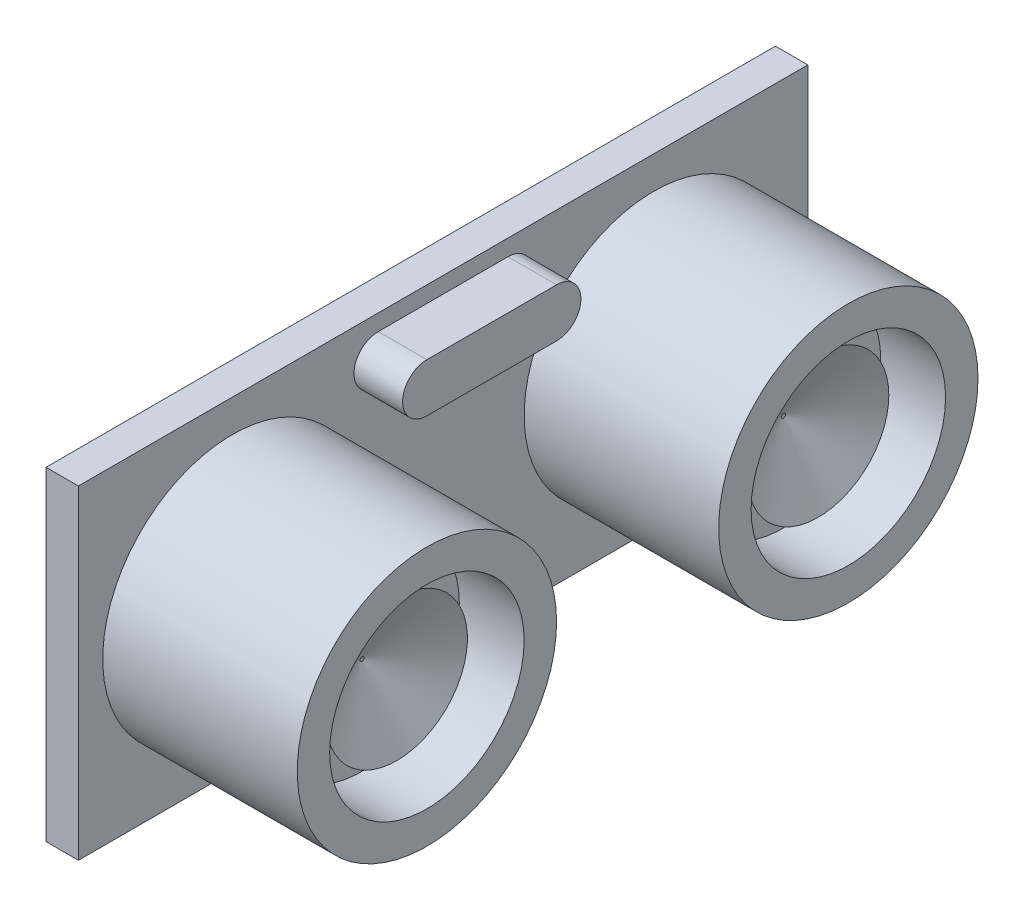
ISO-10303-21;
HEADER;
FILE_DESCRIPTION(('STEP AP214'),'2;1');
FILE_NAME('part.step','',(''),(''),'','','');
FILE_SCHEMA(('AUTOMOTIVE_DESIGN { 1 0 10303 214 1 1 1 1 }'));
ENDSEC;
DATA;
#1=APPLICATION_CONTEXT('core data for automotive mechanical design processes');
#2=APPLICATION_PROTOCOL_DEFINITION('international standard','automotive_design',2000,#1);
#3=PRODUCT_CONTEXT('',#1,'mechanical');
#4=PRODUCT('Part','Part','',(#3));
#5=PRODUCT_RELATED_PRODUCT_CATEGORY('part','',(#4));
#6=PRODUCT_DEFINITION_FORMATION('','',#4);
#7=PRODUCT_DEFINITION_CONTEXT('part definition',#1,'design');
#8=PRODUCT_DEFINITION('design','',#6,#7);
#9=PRODUCT_DEFINITION_SHAPE('','',#8);
#10=(LENGTH_UNIT() NAMED_UNIT(*) SI_UNIT(.MILLI.,.METRE.));
#11=(NAMED_UNIT(*) PLANE_ANGLE_UNIT() SI_UNIT($,.RADIAN.));
#12=(NAMED_UNIT(*) SI_UNIT($,.STERADIAN.) SOLID_ANGLE_UNIT());
#13=UNCERTAINTY_MEASURE_WITH_UNIT(LENGTH_MEASURE(1.E-05),#10,'distance_accuracy_value','');
#14=(GEOMETRIC_REPRESENTATION_CONTEXT(3) GLOBAL_UNCERTAINTY_ASSIGNED_CONTEXT((#13)) GLOBAL_UNIT_ASSIGNED_CONTEXT((#10,
#11,#12)) REPRESENTATION_CONTEXT('',''));
#15=CARTESIAN_POINT('',(0.,0.,0.));
#16=DIRECTION('',(0.,0.,1.));
#17=DIRECTION('',(1.,0.,0.));
#18=AXIS2_PLACEMENT_3D('',#15,#16,#17);
#19=CARTESIAN_POINT('',(10.,0.,-13.));
#20=DIRECTION('',(1.,0.,0.));
#21=DIRECTION('',(0.,0.,-1.));
#22=AXIS2_PLACEMENT_3D('',#19,#20,#21);
#23=CONICAL_SURFACE('',#22,0.123728157781812,1.1017305072658);
#24=CARTESIAN_POINT('',(12.1437341267027,0.,-13.));
#25=DIRECTION('',(-1.,0.,0.));
#26=DIRECTION('',(0.,0.,1.));
#27=AXIS2_PLACEMENT_3D('',#24,#25,#26);
#28=CIRCLE('',#27,4.35374243041184);
#29=CARTESIAN_POINT('',(12.1437341267027,0.,-17.3537424304118));
#30=VERTEX_POINT('',#29);
#31=EDGE_CURVE('E52',#30,#30,#28,.T.);
#32=CARTESIAN_POINT('',(10.,0.,-13.));
#33=DIRECTION('',(-1.,0.,0.));
#34=DIRECTION('',(0.,0.,1.));
#35=AXIS2_PLACEMENT_3D('',#32,#33,#34);
#36=CIRCLE('',#35,0.123728157781812);
#37=CARTESIAN_POINT('',(10.,0.,-13.1237281577818));
#38=VERTEX_POINT('',#37);
#39=EDGE_CURVE('E11',#38,#38,#36,.T.);
#40=CARTESIAN_POINT('',(12.1437341267027,0.,-17.3537424304118));
#41=CARTESIAN_POINT('',(12.1214035628829,0.,-17.3096797817386));
#42=CARTESIAN_POINT('',(12.0990729990631,0.,-17.2656171330654));
#43=CARTESIAN_POINT('',(12.0544118714235,0.,-17.1774918357189));
#44=CARTESIAN_POINT('',(12.0320813076036,0.,-17.1334291870457));
#45=CARTESIAN_POINT('',(11.987420179964,0.,-17.0453038896992));
#46=CARTESIAN_POINT('',(11.9650896161442,0.,-17.001241241026));
#47=CARTESIAN_POINT('',(11.9204284885045,0.,-16.9131159436795));
#48=CARTESIAN_POINT('',(11.8980979246847,0.,-16.8690532950063));
#49=CARTESIAN_POINT('',(11.8534367970451,0.,-16.7809279976599));
#50=CARTESIAN_POINT('',(11.8311062332253,0.,-16.7368653489866));
#51=CARTESIAN_POINT('',(11.7864451055856,0.,-16.6487400516402));
#52=CARTESIAN_POINT('',(11.7641145417658,0.,-16.6046774029669));
#53=CARTESIAN_POINT('',(11.7194534141262,0.,-16.5165521056205));
#54=CARTESIAN_POINT('',(11.6971228503063,0.,-16.4724894569473));
#55=CARTESIAN_POINT('',(11.6524617226667,0.,-16.3843641596008));
#56=CARTESIAN_POINT('',(11.6301311588469,0.,-16.3403015109276));
#57=CARTESIAN_POINT('',(11.5854700312072,0.,-16.2521762135811));
#58=CARTESIAN_POINT('',(11.5631394673874,0.,-16.2081135649079));
#59=CARTESIAN_POINT('',(11.5184783397478,0.,-16.1199882675614));
#60=CARTESIAN_POINT('',(11.496147775928,0.,-16.0759256188882));
#61=CARTESIAN_POINT('',(11.4514866482883,0.,-15.9878003215417));
#62=CARTESIAN_POINT('',(11.4291560844685,0.,-15.9437376728685));
#63=CARTESIAN_POINT('',(11.3844949568289,0.,-15.855612375522));
#64=CARTESIAN_POINT('',(11.362164393009,0.,-15.8115497268488));
#65=CARTESIAN_POINT('',(11.3175032653694,0.,-15.7234244295023));
#66=CARTESIAN_POINT('',(11.2951727015496,0.,-15.6793617808291));
#67=CARTESIAN_POINT('',(11.2505115739099,0.,-15.5912364834827));
#68=CARTESIAN_POINT('',(11.2281810100901,0.,-15.5471738348094));
#69=CARTESIAN_POINT('',(11.1835198824505,0.,-15.459048537463));
#70=CARTESIAN_POINT('',(11.1611893186307,0.,-15.4149858887897));
#71=CARTESIAN_POINT('',(11.116528190991,0.,-15.3268605914433));
#72=CARTESIAN_POINT('',(11.0941976271712,0.,-15.2827979427701));
#73=CARTESIAN_POINT('',(11.0495364995316,0.,-15.1946726454236));
#74=CARTESIAN_POINT('',(11.0272059357117,0.,-15.1506099967504));
#75=CARTESIAN_POINT('',(10.9825448080721,0.,-15.0624846994039));
#76=CARTESIAN_POINT('',(10.9602142442523,0.,-15.0184220507307));
#77=CARTESIAN_POINT('',(10.9155531166126,0.,-14.9302967533842));
#78=CARTESIAN_POINT('',(10.8932225527928,0.,-14.886234104711));
#79=CARTESIAN_POINT('',(10.8485614251532,0.,-14.7981088073645));
#80=CARTESIAN_POINT('',(10.8262308613334,0.,-14.7540461586913));
#81=CARTESIAN_POINT('',(10.7815697336937,0.,-14.6659208613448));
#82=CARTESIAN_POINT('',(10.7592391698739,0.,-14.6218582126716));
#83=CARTESIAN_POINT('',(10.7145780422343,0.,-14.5337329153252));
#84=CARTESIAN_POINT('',(10.6922474784144,0.,-14.4896702666519));
#85=CARTESIAN_POINT('',(10.6475863507748,0.,-14.4015449693055));
#86=CARTESIAN_POINT('',(10.625255786955,0.,-14.3574823206322));
#87=CARTESIAN_POINT('',(10.5805946593153,0.,-14.2693570232858));
#88=CARTESIAN_POINT('',(10.5582640954955,0.,-14.2252943746125));
#89=CARTESIAN_POINT('',(10.5136029678559,0.,-14.1371690772661));
#90=CARTESIAN_POINT('',(10.491272404036,0.,-14.0931064285929));
#91=CARTESIAN_POINT('',(10.4466112763964,0.,-14.0049811312464));
#92=CARTESIAN_POINT('',(10.4242807125766,0.,-13.9609184825732));
#93=CARTESIAN_POINT('',(10.3796195849369,0.,-13.8727931852267));
#94=CARTESIAN_POINT('',(10.3572890211171,0.,-13.8287305365535));
#95=CARTESIAN_POINT('',(10.3126278934775,0.,-13.740605239207));
#96=CARTESIAN_POINT('',(10.2902973296577,0.,-13.6965425905338));
#97=CARTESIAN_POINT('',(10.245636202018,0.,-13.6084172931873));
#98=CARTESIAN_POINT('',(10.2233056381982,0.,-13.5643546445141));
#99=CARTESIAN_POINT('',(10.1786445105586,0.,-13.4762293471676));
#100=CARTESIAN_POINT('',(10.1563139467387,0.,-13.4321666984944));
#101=CARTESIAN_POINT('',(10.1116528190991,0.,-13.344041401148));
#102=CARTESIAN_POINT('',(10.0893222552793,0.,-13.2999787524747));
#103=CARTESIAN_POINT('',(10.0446611276396,0.,-13.2118534551283));
#104=CARTESIAN_POINT('',(10.0223305638198,0.,-13.167790806455));
#105=CARTESIAN_POINT('',(10.,0.,-13.1237281577818));
#106=B_SPLINE_CURVE_WITH_KNOTS('',3,(#40,#41,#42,#43,#44,#45,#46,#47,#48,#49,#50,#51,#52,#53,
#54,#55,#56,#57,#58,#59,#60,#61,#62,#63,#64,#65,#66,#67,#68,#69,#70,#71,#72,#73,#74,#75,#76,#77,
#78,#79,#80,#81,#82,#83,#84,#85,#86,#87,#88,#89,#90,#91,#92,#93,#94,#95,#96,#97,#98,#99,#100,
#101,#102,#103,#104,#105),.UNSPECIFIED.,.F.,.F.,(4,2,2,2,2,2,2,2,2,2,2,2,2,2,2,2,2,2,2,2,2,2,2,
2,2,2,2,2,2,2,2,2,4),(0.,0.148194263713221,0.296388527426442,0.444582791139659,
0.592777054852881,0.740971318566102,0.889165582279323,1.03735984599254,1.18555410970576,
1.33374837341899,1.48194263713221,1.63013690084543,1.77833116455865,1.92652542827187,
2.07471969198509,2.22291395569831,2.37110821941153,2.51930248312475,2.66749674683797,
2.81569101055119,2.96388527426442,3.11207953797764,3.26027380169086,3.40846806540408,
3.5566623291173,3.70485659283052,3.85305085654374,4.00124512025696,4.14943938397018,
4.2976336476834,4.44582791139662,4.59402217510984,4.74221643882306),.UNSPECIFIED.);
#107=EDGE_CURVE('BSEAM46',#30,#38,#106,.T.);
#108=ORIENTED_EDGE('',*,*,#31,.F.);
#109=ORIENTED_EDGE('',*,*,#39,.T.);
#110=ORIENTED_EDGE('',*,*,#107,.T.);
#111=ORIENTED_EDGE('',*,*,#107,.F.);
#112=EDGE_LOOP('',(#108,#110,#109,#111));
#113=FACE_BOUND('',#112,.T.);
#114=ADVANCED_FACE('F46',(#113),#23,.F.);
#115=CARTESIAN_POINT('',(12.1437341267027,0.,-17.3537424304118));
#116=CARTESIAN_POINT('',(9.98096245611618,0.,-15.851185466727));
#117=CARTESIAN_POINT('',(10.,0.,-13.1237281577818));
#118=B_SPLINE_CURVE_WITH_KNOTS('',2,(#115,#116,#117),.UNSPECIFIED.,.F.,.F.,(3,3),(0.,1.),.UNSPECIFIED.);
#119=CARTESIAN_POINT('',(10.,0.,-13.));
#120=DIRECTION('',(-1.,0.,0.));
#121=AXIS1_PLACEMENT('',#119,#120);
#122=SURFACE_OF_REVOLUTION('',#118,#121);
#123=ORIENTED_EDGE('',*,*,#39,.F.);
#124=EDGE_LOOP('',(#123));
#125=FACE_BOUND('',#124,.T.);
#126=ORIENTED_EDGE('',*,*,#31,.T.);
#127=EDGE_LOOP('',(#126));
#128=FACE_BOUND('',#127,.T.);
#129=ADVANCED_FACE('F65',(#125,#128),#122,.T.);
#130=CLOSED_SHELL('',(#114,#129));
#131=MANIFOLD_SOLID_BREP('B2',#130);
#132=CARTESIAN_POINT('',(10.,0.,13.));
#133=DIRECTION('',(1.,0.,0.));
#134=DIRECTION('',(0.,0.,-1.));
#135=AXIS2_PLACEMENT_3D('',#132,#133,#134);
#136=PLANE('',#135);
#137=CARTESIAN_POINT('',(10.,0.,13.));
#138=DIRECTION('',(1.,0.,0.));
#139=DIRECTION('',(0.,0.,-1.));
#140=AXIS2_PLACEMENT_3D('',#137,#138,#139);
#141=CIRCLE('',#140,6.);
#142=CARTESIAN_POINT('',(10.,0.,7.));
#143=VERTEX_POINT('',#142);
#144=EDGE_CURVE('E266',#143,#143,#141,.T.);
#145=ORIENTED_EDGE('',*,*,#144,.T.);
#146=EDGE_LOOP('',(#145));
#147=FACE_BOUND('',#146,.T.);
#148=CARTESIAN_POINT('',(10.,0.,13.));
#149=DIRECTION('',(-1.,0.,0.));
#150=DIRECTION('',(0.,0.,1.));
#151=AXIS2_PLACEMENT_3D('',#148,#149,#150);
#152=CIRCLE('',#151,0.21854967621838);
#153=CARTESIAN_POINT('',(10.,0.,13.2185496762184));
#154=VERTEX_POINT('',#153);
#155=EDGE_CURVE('E88',#154,#154,#152,.T.);
#156=ORIENTED_EDGE('',*,*,#155,.T.);
#157=EDGE_LOOP('',(#156));
#158=FACE_BOUND('',#157,.T.);
#159=ADVANCED_FACE('F84',(#147,#158),#136,.T.);
#160=CARTESIAN_POINT('',(2.,0.,0.));
#161=DIRECTION('',(1.,0.,0.));
#162=DIRECTION('',(0.,0.,-1.));
#163=AXIS2_PLACEMENT_3D('',#160,#161,#162);
#164=PLANE('',#163);
#165=CARTESIAN_POINT('',(2.,0.,13.));
#166=DIRECTION('',(1.,0.,0.));
#167=DIRECTION('',(0.,0.,-1.));
#168=AXIS2_PLACEMENT_3D('',#165,#166,#167);
#169=CIRCLE('',#168,8.);
#170=CARTESIAN_POINT('',(2.,0.,5.));
#171=VERTEX_POINT('',#170);
#172=EDGE_CURVE('E274',#171,#171,#169,.T.);
#173=ORIENTED_EDGE('',*,*,#172,.F.);
#174=EDGE_LOOP('',(#173));
#175=FACE_BOUND('',#174,.T.);
#176=DIRECTION('',(0.,-1.,0.));
#177=VECTOR('',#176,1.);
#178=CARTESIAN_POINT('',(2.,10.,22.5));
#179=LINE('',#178,#177);
#180=CARTESIAN_POINT('',(2.,10.,22.5));
#181=VERTEX_POINT('',#180);
#182=CARTESIAN_POINT('',(2.,-10.,22.5));
#183=VERTEX_POINT('',#182);
#184=EDGE_CURVE('E190',#181,#183,#179,.T.);
#185=ORIENTED_EDGE('',*,*,#184,.T.);
#186=DIRECTION('',(0.,0.,-1.));
#187=VECTOR('',#186,1.);
#188=CARTESIAN_POINT('',(2.,-10.,22.5));
#189=LINE('',#188,#187);
#190=CARTESIAN_POINT('',(2.,-9.99999999999999,-22.5));
#191=VERTEX_POINT('',#190);
#192=EDGE_CURVE('E135',#183,#191,#189,.T.);
#193=ORIENTED_EDGE('',*,*,#192,.T.);
#194=DIRECTION('',(0.,-1.,0.));
#195=VECTOR('',#194,1.);
#196=CARTESIAN_POINT('',(2.,10.,-22.5));
#197=LINE('',#196,#195);
#198=CARTESIAN_POINT('',(2.,10.,-22.5));
#199=VERTEX_POINT('',#198);
#200=EDGE_CURVE('E194',#199,#191,#197,.T.);
#201=ORIENTED_EDGE('',*,*,#200,.F.);
#202=DIRECTION('',(0.,0.,-1.));
#203=VECTOR('',#202,1.);
#204=CARTESIAN_POINT('',(2.,10.,22.5));
#205=LINE('',#204,#203);
#206=EDGE_CURVE('E197',#181,#199,#205,.T.);
#207=ORIENTED_EDGE('',*,*,#206,.F.);
#208=EDGE_LOOP('',(#185,#193,#201,#207));
#209=FACE_BOUND('',#208,.T.);
#210=DIRECTION('',(0.,0.,-1.));
#211=VECTOR('',#210,1.);
#212=CARTESIAN_POINT('',(2.,6.,4.));
#213=LINE('',#212,#211);
#214=CARTESIAN_POINT('',(2.,6.,4.));
#215=VERTEX_POINT('',#214);
#216=CARTESIAN_POINT('',(2.,6.,-4.));
#217=VERTEX_POINT('',#216);
#218=EDGE_CURVE('E286',#215,#217,#213,.T.);
#219=ORIENTED_EDGE('',*,*,#218,.F.);
#220=CARTESIAN_POINT('',(2.,7.5,4.));
#221=DIRECTION('',(1.,0.,0.));
#222=DIRECTION('',(0.,0.,-1.));
#223=AXIS2_PLACEMENT_3D('',#220,#221,#222);
#224=CIRCLE('',#223,1.5);
#225=CARTESIAN_POINT('',(2.,9.,4.));
#226=VERTEX_POINT('',#225);
#227=EDGE_CURVE('E181',#226,#215,#224,.T.);
#228=ORIENTED_EDGE('',*,*,#227,.F.);
#229=DIRECTION('',(0.,0.,1.));
#230=VECTOR('',#229,1.);
#231=CARTESIAN_POINT('',(2.,9.,4.));
#232=LINE('',#231,#230);
#233=CARTESIAN_POINT('',(2.,9.,-4.));
#234=VERTEX_POINT('',#233);
#235=EDGE_CURVE('E177',#234,#226,#232,.T.);
#236=ORIENTED_EDGE('',*,*,#235,.F.);
#237=CARTESIAN_POINT('',(2.,7.5,-4.));
#238=DIRECTION('',(1.,0.,0.));
#239=DIRECTION('',(0.,0.,-1.));
#240=AXIS2_PLACEMENT_3D('',#237,#238,#239);
#241=CIRCLE('',#240,1.5);
#242=EDGE_CURVE('E288',#217,#234,#241,.T.);
#243=ORIENTED_EDGE('',*,*,#242,.F.);
#244=EDGE_LOOP('',(#219,#228,#236,#243));
#245=FACE_BOUND('',#244,.T.);
#246=CARTESIAN_POINT('',(2.,0.,-13.));
#247=DIRECTION('',(1.,0.,0.));
#248=DIRECTION('',(0.,0.,-1.));
#249=AXIS2_PLACEMENT_3D('',#246,#247,#248);
#250=CIRCLE('',#249,8.);
#251=CARTESIAN_POINT('',(2.,0.,-21.));
#252=VERTEX_POINT('',#251);
#253=EDGE_CURVE('E268',#252,#252,#250,.T.);
#254=ORIENTED_EDGE('',*,*,#253,.F.);
#255=EDGE_LOOP('',(#254));
#256=FACE_BOUND('',#255,.T.);
#257=ADVANCED_FACE('F220',(#175,#209,#245,#256),#164,.T.);
#258=CARTESIAN_POINT('',(2.,10.,22.5));
#259=DIRECTION('',(0.,0.,-1.));
#260=DIRECTION('',(-1.,0.,0.));
#261=AXIS2_PLACEMENT_3D('',#258,#259,#260);
#262=PLANE('',#261);
#263=DIRECTION('',(0.,-1.,0.));
#264=VECTOR('',#263,1.);
#265=CARTESIAN_POINT('',(0.,10.,22.5));
#266=LINE('',#265,#264);
#267=CARTESIAN_POINT('',(0.,10.,22.5));
#268=VERTEX_POINT('',#267);
#269=CARTESIAN_POINT('',(0.,-10.,22.5));
#270=VERTEX_POINT('',#269);
#271=EDGE_CURVE('E183',#268,#270,#266,.T.);
#272=ORIENTED_EDGE('',*,*,#271,.T.);
#273=DIRECTION('',(-1.,0.,0.));
#274=VECTOR('',#273,1.);
#275=CARTESIAN_POINT('',(2.,-10.,22.5));
#276=LINE('',#275,#274);
#277=EDGE_CURVE('E44',#183,#270,#276,.T.);
#278=ORIENTED_EDGE('',*,*,#277,.F.);
#279=ORIENTED_EDGE('',*,*,#184,.F.);
#280=DIRECTION('',(-1.,0.,0.));
#281=VECTOR('',#280,1.);
#282=CARTESIAN_POINT('',(2.,10.,22.5));
#283=LINE('',#282,#281);
#284=EDGE_CURVE('E109',#181,#268,#283,.T.);
#285=ORIENTED_EDGE('',*,*,#284,.T.);
#286=EDGE_LOOP('',(#272,#278,#279,#285));
#287=FACE_BOUND('',#286,.T.);
#288=ADVANCED_FACE('F86',(#287),#262,.F.);
#289=CARTESIAN_POINT('',(2.,-10.,22.5));
#290=DIRECTION('',(0.,1.,0.));
#291=DIRECTION('',(0.,0.,1.));
#292=AXIS2_PLACEMENT_3D('',#289,#290,#291);
#293=PLANE('',#292);
#294=DIRECTION('',(0.,0.,-1.));
#295=VECTOR('',#294,1.);
#296=CARTESIAN_POINT('',(0.,-10.,22.5));
#297=LINE('',#296,#295);
#298=CARTESIAN_POINT('',(0.,-9.99999999999999,-22.5));
#299=VERTEX_POINT('',#298);
#300=EDGE_CURVE('E185',#270,#299,#297,.T.);
#301=ORIENTED_EDGE('',*,*,#300,.T.);
#302=DIRECTION('',(-1.,0.,0.));
#303=VECTOR('',#302,1.);
#304=CARTESIAN_POINT('',(2.,-9.99999999999999,-22.5));
#305=LINE('',#304,#303);
#306=EDGE_CURVE('E93',#191,#299,#305,.T.);
#307=ORIENTED_EDGE('',*,*,#306,.F.);
#308=ORIENTED_EDGE('',*,*,#192,.F.);
#309=ORIENTED_EDGE('',*,*,#277,.T.);
#310=EDGE_LOOP('',(#301,#307,#308,#309));
#311=FACE_BOUND('',#310,.T.);
#312=ADVANCED_FACE('F213',(#311),#293,.F.);
#313=CARTESIAN_POINT('',(2.,10.,-22.5));
#314=DIRECTION('',(0.,0.,-1.));
#315=DIRECTION('',(-1.,0.,0.));
#316=AXIS2_PLACEMENT_3D('',#313,#314,#315);
#317=PLANE('',#316);
#318=DIRECTION('',(0.,-1.,0.));
#319=VECTOR('',#318,1.);
#320=CARTESIAN_POINT('',(0.,10.,-22.5));
#321=LINE('',#320,#319);
#322=CARTESIAN_POINT('',(0.,10.,-22.5));
#323=VERTEX_POINT('',#322);
#324=EDGE_CURVE('E201',#323,#299,#321,.T.);
#325=ORIENTED_EDGE('',*,*,#324,.F.);
#326=DIRECTION('',(-1.,0.,0.));
#327=VECTOR('',#326,1.);
#328=CARTESIAN_POINT('',(2.,10.,-22.5));
#329=LINE('',#328,#327);
#330=EDGE_CURVE('E207',#199,#323,#329,.T.);
#331=ORIENTED_EDGE('',*,*,#330,.F.);
#332=ORIENTED_EDGE('',*,*,#200,.T.);
#333=ORIENTED_EDGE('',*,*,#306,.T.);
#334=EDGE_LOOP('',(#325,#331,#332,#333));
#335=FACE_BOUND('',#334,.T.);
#336=ADVANCED_FACE('F211',(#335),#317,.T.);
#337=CARTESIAN_POINT('',(2.,10.,22.5));
#338=DIRECTION('',(0.,1.,0.));
#339=DIRECTION('',(0.,0.,1.));
#340=AXIS2_PLACEMENT_3D('',#337,#338,#339);
#341=PLANE('',#340);
#342=DIRECTION('',(0.,0.,-1.));
#343=VECTOR('',#342,1.);
#344=CARTESIAN_POINT('',(0.,10.,22.5));
#345=LINE('',#344,#343);
#346=EDGE_CURVE('E192',#268,#323,#345,.T.);
#347=ORIENTED_EDGE('',*,*,#346,.F.);
#348=ORIENTED_EDGE('',*,*,#284,.F.);
#349=ORIENTED_EDGE('',*,*,#206,.T.);
#350=ORIENTED_EDGE('',*,*,#330,.T.);
#351=EDGE_LOOP('',(#347,#348,#349,#350));
#352=FACE_BOUND('',#351,.T.);
#353=ADVANCED_FACE('F217',(#352),#341,.T.);
#354=CARTESIAN_POINT('',(0.,0.,0.));
#355=DIRECTION('',(1.,0.,0.));
#356=DIRECTION('',(0.,0.,-1.));
#357=AXIS2_PLACEMENT_3D('',#354,#355,#356);
#358=PLANE('',#357);
#359=ORIENTED_EDGE('',*,*,#271,.F.);
#360=ORIENTED_EDGE('',*,*,#346,.T.);
#361=ORIENTED_EDGE('',*,*,#324,.T.);
#362=ORIENTED_EDGE('',*,*,#300,.F.);
#363=EDGE_LOOP('',(#359,#360,#361,#362));
#364=FACE_BOUND('',#363,.T.);
#365=ADVANCED_FACE('F216',(#364),#358,.F.);
#366=CARTESIAN_POINT('',(5.,7.5,4.));
#367=DIRECTION('',(-1.,0.,0.));
#368=DIRECTION('',(0.,0.,1.));
#369=AXIS2_PLACEMENT_3D('',#366,#367,#368);
#370=CYLINDRICAL_SURFACE('',#369,1.5);
#371=ORIENTED_EDGE('',*,*,#227,.T.);
#372=DIRECTION('',(-1.,0.,0.));
#373=VECTOR('',#372,1.);
#374=CARTESIAN_POINT('',(5.,6.,4.));
#375=LINE('',#374,#373);
#376=CARTESIAN_POINT('',(5.,6.,4.));
#377=VERTEX_POINT('',#376);
#378=EDGE_CURVE('E162',#377,#215,#375,.T.);
#379=ORIENTED_EDGE('',*,*,#378,.F.);
#380=CARTESIAN_POINT('',(5.,7.5,4.));
#381=DIRECTION('',(1.,0.,0.));
#382=DIRECTION('',(0.,0.,-1.));
#383=AXIS2_PLACEMENT_3D('',#380,#381,#382);
#384=CIRCLE('',#383,1.5);
#385=CARTESIAN_POINT('',(5.,9.,4.));
#386=VERTEX_POINT('',#385);
#387=EDGE_CURVE('E169',#386,#377,#384,.T.);
#388=ORIENTED_EDGE('',*,*,#387,.F.);
#389=DIRECTION('',(-1.,0.,0.));
#390=VECTOR('',#389,1.);
#391=CARTESIAN_POINT('',(5.,9.,4.));
#392=LINE('',#391,#390);
#393=EDGE_CURVE('E284',#386,#226,#392,.T.);
#394=ORIENTED_EDGE('',*,*,#393,.T.);
#395=EDGE_LOOP('',(#371,#379,#388,#394));
#396=FACE_BOUND('',#395,.T.);
#397=ADVANCED_FACE('F179',(#396),#370,.T.);
#398=CARTESIAN_POINT('',(5.,6.,4.));
#399=DIRECTION('',(0.,1.,0.));
#400=DIRECTION('',(0.,0.,1.));
#401=AXIS2_PLACEMENT_3D('',#398,#399,#400);
#402=PLANE('',#401);
#403=ORIENTED_EDGE('',*,*,#218,.T.);
#404=DIRECTION('',(-1.,0.,0.));
#405=VECTOR('',#404,1.);
#406=CARTESIAN_POINT('',(5.,6.,-4.));
#407=LINE('',#406,#405);
#408=CARTESIAN_POINT('',(5.,6.,-4.));
#409=VERTEX_POINT('',#408);
#410=EDGE_CURVE('E165',#409,#217,#407,.T.);
#411=ORIENTED_EDGE('',*,*,#410,.F.);
#412=DIRECTION('',(0.,0.,-1.));
#413=VECTOR('',#412,1.);
#414=CARTESIAN_POINT('',(5.,6.,4.));
#415=LINE('',#414,#413);
#416=EDGE_CURVE('E158',#377,#409,#415,.T.);
#417=ORIENTED_EDGE('',*,*,#416,.F.);
#418=ORIENTED_EDGE('',*,*,#378,.T.);
#419=EDGE_LOOP('',(#403,#411,#417,#418));
#420=FACE_BOUND('',#419,.T.);
#421=ADVANCED_FACE('F160',(#420),#402,.F.);
#422=CARTESIAN_POINT('',(5.,7.5,-4.));
#423=DIRECTION('',(-1.,0.,0.));
#424=DIRECTION('',(0.,0.,1.));
#425=AXIS2_PLACEMENT_3D('',#422,#423,#424);
#426=CYLINDRICAL_SURFACE('',#425,1.5);
#427=ORIENTED_EDGE('',*,*,#242,.T.);
#428=DIRECTION('',(-1.,0.,0.));
#429=VECTOR('',#428,1.);
#430=CARTESIAN_POINT('',(5.,9.,-4.));
#431=LINE('',#430,#429);
#432=CARTESIAN_POINT('',(5.,9.,-4.));
#433=VERTEX_POINT('',#432);
#434=EDGE_CURVE('E100',#433,#234,#431,.T.);
#435=ORIENTED_EDGE('',*,*,#434,.F.);
#436=CARTESIAN_POINT('',(5.,7.5,-4.));
#437=DIRECTION('',(1.,0.,0.));
#438=DIRECTION('',(0.,0.,-1.));
#439=AXIS2_PLACEMENT_3D('',#436,#437,#438);
#440=CIRCLE('',#439,1.5);
#441=EDGE_CURVE('E168',#409,#433,#440,.T.);
#442=ORIENTED_EDGE('',*,*,#441,.F.);
#443=ORIENTED_EDGE('',*,*,#410,.T.);
#444=EDGE_LOOP('',(#427,#435,#442,#443));
#445=FACE_BOUND('',#444,.T.);
#446=ADVANCED_FACE('F295',(#445),#426,.T.);
#447=CARTESIAN_POINT('',(5.,9.,4.));
#448=DIRECTION('',(0.,-1.,0.));
#449=DIRECTION('',(0.,0.,-1.));
#450=AXIS2_PLACEMENT_3D('',#447,#448,#449);
#451=PLANE('',#450);
#452=ORIENTED_EDGE('',*,*,#235,.T.);
#453=ORIENTED_EDGE('',*,*,#393,.F.);
#454=DIRECTION('',(0.,0.,1.));
#455=VECTOR('',#454,1.);
#456=CARTESIAN_POINT('',(5.,9.,4.));
#457=LINE('',#456,#455);
#458=EDGE_CURVE('E173',#433,#386,#457,.T.);
#459=ORIENTED_EDGE('',*,*,#458,.F.);
#460=ORIENTED_EDGE('',*,*,#434,.T.);
#461=EDGE_LOOP('',(#452,#453,#459,#460));
#462=FACE_BOUND('',#461,.T.);
#463=ADVANCED_FACE('F296',(#462),#451,.F.);
#464=CARTESIAN_POINT('',(5.,7.5,4.));
#465=DIRECTION('',(1.,0.,0.));
#466=DIRECTION('',(0.,0.,-1.));
#467=AXIS2_PLACEMENT_3D('',#464,#465,#466);
#468=PLANE('',#467);
#469=ORIENTED_EDGE('',*,*,#387,.T.);
#470=ORIENTED_EDGE('',*,*,#416,.T.);
#471=ORIENTED_EDGE('',*,*,#441,.T.);
#472=ORIENTED_EDGE('',*,*,#458,.T.);
#473=EDGE_LOOP('',(#469,#470,#471,#472));
#474=FACE_BOUND('',#473,.T.);
#475=ADVANCED_FACE('F172',(#474),#468,.T.);
#476=CARTESIAN_POINT('',(14.,0.,13.));
#477=DIRECTION('',(-1.,0.,0.));
#478=DIRECTION('',(0.,0.,1.));
#479=AXIS2_PLACEMENT_3D('',#476,#477,#478);
#480=CYLINDRICAL_SURFACE('',#479,8.);
#481=CARTESIAN_POINT('',(14.,0.,13.));
#482=DIRECTION('',(1.,0.,0.));
#483=DIRECTION('',(0.,0.,-1.));
#484=AXIS2_PLACEMENT_3D('',#481,#482,#483);
#485=CIRCLE('',#484,8.);
#486=CARTESIAN_POINT('',(14.,0.,5.));
#487=VERTEX_POINT('',#486);
#488=EDGE_CURVE('E277',#487,#487,#485,.T.);
#489=ORIENTED_EDGE('',*,*,#488,.F.);
#490=EDGE_LOOP('',(#489));
#491=FACE_BOUND('',#490,.T.);
#492=ORIENTED_EDGE('',*,*,#172,.T.);
#493=EDGE_LOOP('',(#492));
#494=FACE_BOUND('',#493,.T.);
#495=ADVANCED_FACE('F303',(#491,#494),#480,.T.);
#496=CARTESIAN_POINT('',(14.,0.,13.));
#497=DIRECTION('',(1.,0.,0.));
#498=DIRECTION('',(0.,0.,-1.));
#499=AXIS2_PLACEMENT_3D('',#496,#497,#498);
#500=PLANE('',#499);
#501=CARTESIAN_POINT('',(14.,0.,13.));
#502=DIRECTION('',(1.,0.,0.));
#503=DIRECTION('',(0.,0.,-1.));
#504=AXIS2_PLACEMENT_3D('',#501,#502,#503);
#505=CIRCLE('',#504,6.);
#506=CARTESIAN_POINT('',(14.,0.,7.));
#507=VERTEX_POINT('',#506);
#508=EDGE_CURVE('E263',#507,#507,#505,.T.);
#509=ORIENTED_EDGE('',*,*,#508,.F.);
#510=EDGE_LOOP('',(#509));
#511=FACE_BOUND('',#510,.T.);
#512=ORIENTED_EDGE('',*,*,#488,.T.);
#513=EDGE_LOOP('',(#512));
#514=FACE_BOUND('',#513,.T.);
#515=ADVANCED_FACE('F367',(#511,#514),#500,.T.);
#516=CARTESIAN_POINT('',(14.,0.,-13.));
#517=DIRECTION('',(-1.,0.,0.));
#518=DIRECTION('',(0.,0.,1.));
#519=AXIS2_PLACEMENT_3D('',#516,#517,#518);
#520=CYLINDRICAL_SURFACE('',#519,8.);
#521=CARTESIAN_POINT('',(14.,0.,-13.));
#522=DIRECTION('',(1.,0.,0.));
#523=DIRECTION('',(0.,0.,-1.));
#524=AXIS2_PLACEMENT_3D('',#521,#522,#523);
#525=CIRCLE('',#524,8.);
#526=CARTESIAN_POINT('',(14.,0.,-21.));
#527=VERTEX_POINT('',#526);
#528=EDGE_CURVE('E271',#527,#527,#525,.T.);
#529=ORIENTED_EDGE('',*,*,#528,.F.);
#530=EDGE_LOOP('',(#529));
#531=FACE_BOUND('',#530,.T.);
#532=ORIENTED_EDGE('',*,*,#253,.T.);
#533=EDGE_LOOP('',(#532));
#534=FACE_BOUND('',#533,.T.);
#535=ADVANCED_FACE('F374',(#531,#534),#520,.T.);
#536=CARTESIAN_POINT('',(14.,0.,-13.));
#537=DIRECTION('',(1.,0.,0.));
#538=DIRECTION('',(0.,0.,-1.));
#539=AXIS2_PLACEMENT_3D('',#536,#537,#538);
#540=PLANE('',#539);
#541=CARTESIAN_POINT('',(14.,0.,-13.));
#542=DIRECTION('',(1.,0.,0.));
#543=DIRECTION('',(0.,0.,-1.));
#544=AXIS2_PLACEMENT_3D('',#541,#542,#543);
#545=CIRCLE('',#544,6.);
#546=CARTESIAN_POINT('',(14.,0.,-19.));
#547=VERTEX_POINT('',#546);
#548=EDGE_CURVE('E255',#547,#547,#545,.T.);
#549=ORIENTED_EDGE('',*,*,#548,.F.);
#550=EDGE_LOOP('',(#549));
#551=FACE_BOUND('',#550,.T.);
#552=ORIENTED_EDGE('',*,*,#528,.T.);
#553=EDGE_LOOP('',(#552));
#554=FACE_BOUND('',#553,.T.);
#555=ADVANCED_FACE('F379',(#551,#554),#540,.T.);
#556=CARTESIAN_POINT('',(10.,0.,13.));
#557=DIRECTION('',(1.,0.,0.));
#558=DIRECTION('',(0.,0.,-1.));
#559=AXIS2_PLACEMENT_3D('',#556,#557,#558);
#560=CYLINDRICAL_SURFACE('',#559,6.);
#561=ORIENTED_EDGE('',*,*,#144,.F.);
#562=EDGE_LOOP('',(#561));
#563=FACE_BOUND('',#562,.T.);
#564=ORIENTED_EDGE('',*,*,#508,.T.);
#565=EDGE_LOOP('',(#564));
#566=FACE_BOUND('',#565,.T.);
#567=ADVANCED_FACE('F396',(#563,#566),#560,.F.);
#568=CARTESIAN_POINT('',(10.,0.,-13.));
#569=DIRECTION('',(1.,0.,0.));
#570=DIRECTION('',(0.,0.,-1.));
#571=AXIS2_PLACEMENT_3D('',#568,#569,#570);
#572=CYLINDRICAL_SURFACE('',#571,6.);
#573=CARTESIAN_POINT('',(10.,0.,-13.));
#574=DIRECTION('',(1.,0.,0.));
#575=DIRECTION('',(0.,0.,-1.));
#576=AXIS2_PLACEMENT_3D('',#573,#574,#575);
#577=CIRCLE('',#576,6.);
#578=CARTESIAN_POINT('',(10.,0.,-19.));
#579=VERTEX_POINT('',#578);
#580=EDGE_CURVE('E260',#579,#579,#577,.T.);
#581=ORIENTED_EDGE('',*,*,#580,.F.);
#582=EDGE_LOOP('',(#581));
#583=FACE_BOUND('',#582,.T.);
#584=ORIENTED_EDGE('',*,*,#548,.T.);
#585=EDGE_LOOP('',(#584));
#586=FACE_BOUND('',#585,.T.);
#587=ADVANCED_FACE('F406',(#583,#586),#572,.F.);
#588=CARTESIAN_POINT('',(10.,0.,-13.));
#589=DIRECTION('',(1.,0.,0.));
#590=DIRECTION('',(0.,0.,-1.));
#591=AXIS2_PLACEMENT_3D('',#588,#589,#590);
#592=PLANE('',#591);
#593=ORIENTED_EDGE('',*,*,#580,.T.);
#594=EDGE_LOOP('',(#593));
#595=FACE_BOUND('',#594,.T.);
#596=ADVANCED_FACE('F415',(#595),#592,.T.);
#597=CARTESIAN_POINT('',(10.,0.,13.));
#598=DIRECTION('',(1.,0.,0.));
#599=DIRECTION('',(0.,0.,1.));
#600=AXIS2_PLACEMENT_3D('',#597,#598,#599);
#601=CONICAL_SURFACE('',#600,0.123728157781812,1.1017305072658);
#602=CARTESIAN_POINT('',(12.1437341267027,0.,13.));
#603=DIRECTION('',(1.,0.,0.));
#604=DIRECTION('',(0.,0.,-1.));
#605=AXIS2_PLACEMENT_3D('',#602,#603,#604);
#606=CIRCLE('',#605,4.35374243041184);
#607=CARTESIAN_POINT('',(12.1437341267027,0.,17.3537424304118));
#608=VERTEX_POINT('',#607);
#609=EDGE_CURVE('E252',#608,#608,#606,.T.);
#610=CARTESIAN_POINT('',(10.,0.,13.));
#611=DIRECTION('',(1.,0.,0.));
#612=DIRECTION('',(0.,0.,-1.));
#613=AXIS2_PLACEMENT_3D('',#610,#611,#612);
#614=CIRCLE('',#613,0.123728157781812);
#615=CARTESIAN_POINT('',(10.,0.,13.1237281577818));
#616=VERTEX_POINT('',#615);
#617=EDGE_CURVE('E250',#616,#616,#614,.T.);
#618=CARTESIAN_POINT('',(12.1437341267027,0.,17.3537424304118));
#619=CARTESIAN_POINT('',(12.1214035628829,0.,17.3096797817386));
#620=CARTESIAN_POINT('',(12.0990729990631,0.,17.2656171330654));
#621=CARTESIAN_POINT('',(12.0544118714235,0.,17.1774918357189));
#622=CARTESIAN_POINT('',(12.0320813076036,0.,17.1334291870457));
#623=CARTESIAN_POINT('',(11.987420179964,0.,17.0453038896992));
#624=CARTESIAN_POINT('',(11.9650896161442,0.,17.001241241026));
#625=CARTESIAN_POINT('',(11.9204284885045,0.,16.9131159436795));
#626=CARTESIAN_POINT('',(11.8980979246847,0.,16.8690532950063));
#627=CARTESIAN_POINT('',(11.8534367970451,0.,16.7809279976599));
#628=CARTESIAN_POINT('',(11.8311062332253,0.,16.7368653489866));
#629=CARTESIAN_POINT('',(11.7864451055856,0.,16.6487400516402));
#630=CARTESIAN_POINT('',(11.7641145417658,0.,16.6046774029669));
#631=CARTESIAN_POINT('',(11.7194534141262,0.,16.5165521056205));
#632=CARTESIAN_POINT('',(11.6971228503063,0.,16.4724894569472));
#633=CARTESIAN_POINT('',(11.6524617226667,0.,16.3843641596008));
#634=CARTESIAN_POINT('',(11.6301311588469,0.,16.3403015109276));
#635=CARTESIAN_POINT('',(11.5854700312072,0.,16.2521762135811));
#636=CARTESIAN_POINT('',(11.5631394673874,0.,16.2081135649079));
#637=CARTESIAN_POINT('',(11.5184783397478,0.,16.1199882675614));
#638=CARTESIAN_POINT('',(11.496147775928,0.,16.0759256188882));
#639=CARTESIAN_POINT('',(11.4514866482883,0.,15.9878003215417));
#640=CARTESIAN_POINT('',(11.4291560844685,0.,15.9437376728685));
#641=CARTESIAN_POINT('',(11.3844949568289,0.,15.855612375522));
#642=CARTESIAN_POINT('',(11.362164393009,0.,15.8115497268488));
#643=CARTESIAN_POINT('',(11.3175032653694,0.,15.7234244295023));
#644=CARTESIAN_POINT('',(11.2951727015496,0.,15.6793617808291));
#645=CARTESIAN_POINT('',(11.2505115739099,0.,15.5912364834827));
#646=CARTESIAN_POINT('',(11.2281810100901,0.,15.5471738348094));
#647=CARTESIAN_POINT('',(11.1835198824505,0.,15.459048537463));
#648=CARTESIAN_POINT('',(11.1611893186307,0.,15.4149858887897));
#649=CARTESIAN_POINT('',(11.116528190991,0.,15.3268605914433));
#650=CARTESIAN_POINT('',(11.0941976271712,0.,15.2827979427701));
#651=CARTESIAN_POINT('',(11.0495364995316,0.,15.1946726454236));
#652=CARTESIAN_POINT('',(11.0272059357117,0.,15.1506099967504));
#653=CARTESIAN_POINT('',(10.9825448080721,0.,15.0624846994039));
#654=CARTESIAN_POINT('',(10.9602142442523,0.,15.0184220507307));
#655=CARTESIAN_POINT('',(10.9155531166126,0.,14.9302967533842));
#656=CARTESIAN_POINT('',(10.8932225527928,0.,14.886234104711));
#657=CARTESIAN_POINT('',(10.8485614251532,0.,14.7981088073645));
#658=CARTESIAN_POINT('',(10.8262308613333,0.,14.7540461586913));
#659=CARTESIAN_POINT('',(10.7815697336937,0.,14.6659208613448));
#660=CARTESIAN_POINT('',(10.7592391698739,0.,14.6218582126716));
#661=CARTESIAN_POINT('',(10.7145780422342,0.,14.5337329153252));
#662=CARTESIAN_POINT('',(10.6922474784144,0.,14.4896702666519));
#663=CARTESIAN_POINT('',(10.6475863507748,0.,14.4015449693055));
#664=CARTESIAN_POINT('',(10.625255786955,0.,14.3574823206322));
#665=CARTESIAN_POINT('',(10.5805946593153,0.,14.2693570232858));
#666=CARTESIAN_POINT('',(10.5582640954955,0.,14.2252943746125));
#667=CARTESIAN_POINT('',(10.5136029678559,0.,14.1371690772661));
#668=CARTESIAN_POINT('',(10.491272404036,0.,14.0931064285929));
#669=CARTESIAN_POINT('',(10.4466112763964,0.,14.0049811312464));
#670=CARTESIAN_POINT('',(10.4242807125766,0.,13.9609184825732));
#671=CARTESIAN_POINT('',(10.3796195849369,0.,13.8727931852267));
#672=CARTESIAN_POINT('',(10.3572890211171,0.,13.8287305365535));
#673=CARTESIAN_POINT('',(10.3126278934775,0.,13.740605239207));
#674=CARTESIAN_POINT('',(10.2902973296577,0.,13.6965425905338));
#675=CARTESIAN_POINT('',(10.245636202018,0.,13.6084172931873));
#676=CARTESIAN_POINT('',(10.2233056381982,0.,13.5643546445141));
#677=CARTESIAN_POINT('',(10.1786445105586,0.,13.4762293471676));
#678=CARTESIAN_POINT('',(10.1563139467387,0.,13.4321666984944));
#679=CARTESIAN_POINT('',(10.1116528190991,0.,13.344041401148));
#680=CARTESIAN_POINT('',(10.0893222552793,0.,13.2999787524747));
#681=CARTESIAN_POINT('',(10.0446611276396,0.,13.2118534551283));
#682=CARTESIAN_POINT('',(10.0223305638198,0.,13.167790806455));
#683=CARTESIAN_POINT('',(10.,0.,13.1237281577818));
#684=B_SPLINE_CURVE_WITH_KNOTS('',3,(#618,#619,#620,#621,#622,#623,#624,#625,#626,#627,#628,
#629,#630,#631,#632,#633,#634,#635,#636,#637,#638,#639,#640,#641,#642,#643,#644,#645,#646,#647,
#648,#649,#650,#651,#652,#653,#654,#655,#656,#657,#658,#659,#660,#661,#662,#663,#664,#665,#666,
#667,#668,#669,#670,#671,#672,#673,#674,#675,#676,#677,#678,#679,#680,#681,#682,#683),
.UNSPECIFIED.,.F.,.F.,(4,2,2,2,2,2,2,2,2,2,2,2,2,2,2,2,2,2,2,2,2,2,2,2,2,2,2,2,2,2,2,2,4),(0.,
0.148194263713221,0.29638852742644,0.444582791139664,0.592777054852881,0.740971318566103,
0.889165582279323,1.03735984599254,1.18555410970577,1.33374837341899,1.48194263713221,
1.63013690084543,1.77833116455865,1.92652542827187,2.07471969198509,2.22291395569831,
2.37110821941153,2.51930248312475,2.66749674683797,2.8156910105512,2.96388527426442,
3.11207953797764,3.26027380169086,3.40846806540408,3.5566623291173,3.70485659283052,
3.85305085654374,4.00124512025696,4.14943938397018,4.2976336476834,4.44582791139662,
4.59402217510985,4.74221643882307),.UNSPECIFIED.);
#685=EDGE_CURVE('BSEAM245',#608,#616,#684,.T.);
#686=ORIENTED_EDGE('',*,*,#609,.T.);
#687=ORIENTED_EDGE('',*,*,#617,.F.);
#688=ORIENTED_EDGE('',*,*,#685,.T.);
#689=ORIENTED_EDGE('',*,*,#685,.F.);
#690=EDGE_LOOP('',(#686,#688,#687,#689));
#691=FACE_BOUND('',#690,.T.);
#692=ADVANCED_FACE('F245',(#691),#601,.F.);
#693=CARTESIAN_POINT('',(12.1437341267027,0.,17.3537424304118));
#694=CARTESIAN_POINT('',(9.98096245611618,0.,15.851185466727));
#695=CARTESIAN_POINT('',(10.,0.,13.1237281577818));
#696=B_SPLINE_CURVE_WITH_KNOTS('',2,(#693,#694,#695),.UNSPECIFIED.,.F.,.F.,(3,3),(0.,1.),.UNSPECIFIED.);
#697=CARTESIAN_POINT('',(10.,0.,13.));
#698=DIRECTION('',(-1.,0.,0.));
#699=AXIS1_PLACEMENT('',#697,#698);
#700=SURFACE_OF_REVOLUTION('',#696,#699);
#701=ORIENTED_EDGE('',*,*,#155,.F.);
#702=EDGE_LOOP('',(#701));
#703=FACE_BOUND('',#702,.T.);
#704=ORIENTED_EDGE('',*,*,#609,.F.);
#705=EDGE_LOOP('',(#704));
#706=FACE_BOUND('',#705,.T.);
#707=ADVANCED_FACE('F240',(#703,#706),#700,.T.);
#708=ORIENTED_EDGE('',*,*,#617,.T.);
#709=EDGE_LOOP('',(#708));
#710=FACE_BOUND('',#709,.T.);
#711=ADVANCED_FACE('F232',(#710),#136,.T.);
#712=CLOSED_SHELL('',(#159,#257,#288,#312,#336,#353,#365,#397,#421,#446,#463,#475,#495,#515,
#535,#555,#567,#587,#596,#692,#707,#711));
#713=MANIFOLD_SOLID_BREP('B6',#712);
#714=ADVANCED_BREP_SHAPE_REPRESENTATION('',(#18,#131,#713),#14);
#715=SHAPE_DEFINITION_REPRESENTATION(#9,#714);
ENDSEC;
END-ISO-10303-21;
